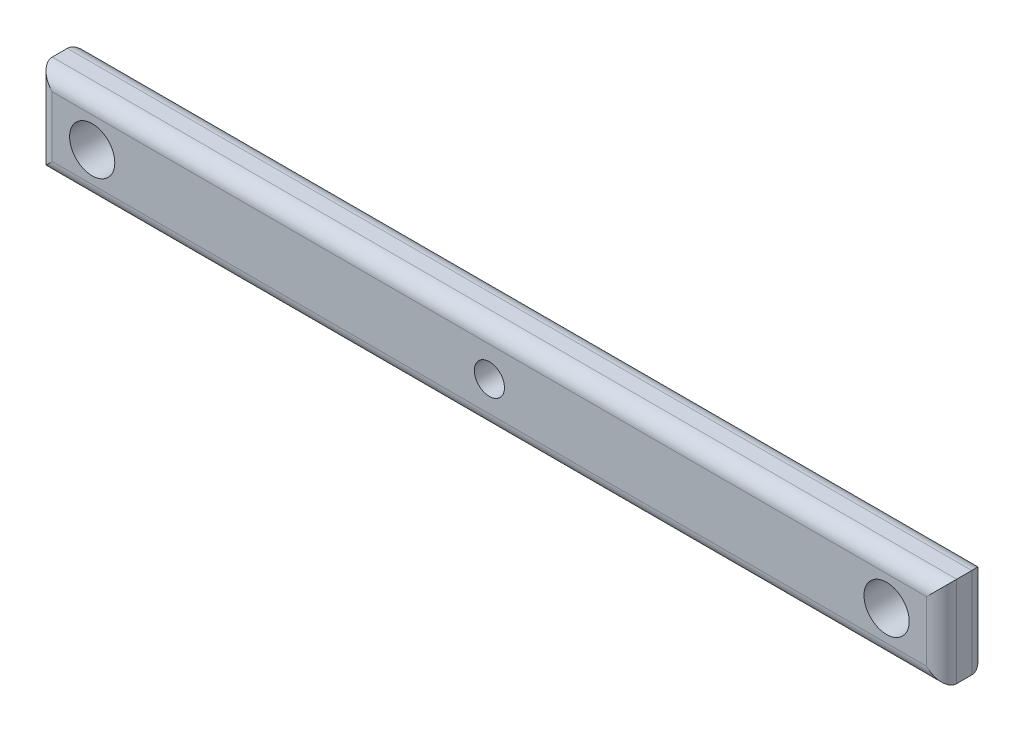
ISO-10303-21;
HEADER;
FILE_DESCRIPTION(('STEP AP214'),'2;1');
FILE_NAME('part.step','',(''),(''),'','','');
FILE_SCHEMA(('AUTOMOTIVE_DESIGN { 1 0 10303 214 1 1 1 1 }'));
ENDSEC;
DATA;
#1=APPLICATION_CONTEXT('core data for automotive mechanical design processes');
#2=APPLICATION_PROTOCOL_DEFINITION('international standard','automotive_design',2000,#1);
#3=PRODUCT_CONTEXT('',#1,'mechanical');
#4=PRODUCT('Part','Part','',(#3));
#5=PRODUCT_RELATED_PRODUCT_CATEGORY('part','',(#4));
#6=PRODUCT_DEFINITION_FORMATION('','',#4);
#7=PRODUCT_DEFINITION_CONTEXT('part definition',#1,'design');
#8=PRODUCT_DEFINITION('design','',#6,#7);
#9=PRODUCT_DEFINITION_SHAPE('','',#8);
#10=(LENGTH_UNIT() NAMED_UNIT(*) SI_UNIT(.MILLI.,.METRE.));
#11=(NAMED_UNIT(*) PLANE_ANGLE_UNIT() SI_UNIT($,.RADIAN.));
#12=(NAMED_UNIT(*) SI_UNIT($,.STERADIAN.) SOLID_ANGLE_UNIT());
#13=UNCERTAINTY_MEASURE_WITH_UNIT(LENGTH_MEASURE(1.E-05),#10,'distance_accuracy_value','');
#14=(GEOMETRIC_REPRESENTATION_CONTEXT(3) GLOBAL_UNCERTAINTY_ASSIGNED_CONTEXT((#13)) GLOBAL_UNIT_ASSIGNED_CONTEXT((#10,
#11,#12)) REPRESENTATION_CONTEXT('',''));
#15=CARTESIAN_POINT('',(0.,0.,0.));
#16=DIRECTION('',(0.,0.,1.));
#17=DIRECTION('',(1.,0.,0.));
#18=AXIS2_PLACEMENT_3D('',#15,#16,#17);
#19=CARTESIAN_POINT('',(-30.,3.,3.));
#20=DIRECTION('',(1.,0.,0.));
#21=DIRECTION('',(0.,0.,-1.));
#22=AXIS2_PLACEMENT_3D('',#19,#20,#21);
#23=PLANE('',#22);
#24=DIRECTION('',(0.,0.,-1.));
#25=VECTOR('',#24,1.);
#26=CARTESIAN_POINT('',(-30.,3.,3.));
#27=LINE('',#26,#25);
#28=CARTESIAN_POINT('',(-30.,3.,2.));
#29=VERTEX_POINT('',#28);
#30=CARTESIAN_POINT('',(-30.,3.,1.));
#31=VERTEX_POINT('',#30);
#32=EDGE_CURVE('E149',#29,#31,#27,.T.);
#33=ORIENTED_EDGE('',*,*,#32,.T.);
#34=DIRECTION('',(0.,-1.,0.));
#35=VECTOR('',#34,1.);
#36=CARTESIAN_POINT('',(-30.,3.,1.));
#37=LINE('',#36,#35);
#38=CARTESIAN_POINT('',(-30.,-3.,1.));
#39=VERTEX_POINT('',#38);
#40=EDGE_CURVE('E158',#31,#39,#37,.T.);
#41=ORIENTED_EDGE('',*,*,#40,.T.);
#42=DIRECTION('',(0.,0.,-1.));
#43=VECTOR('',#42,1.);
#44=CARTESIAN_POINT('',(-30.,-3.,3.));
#45=LINE('',#44,#43);
#46=CARTESIAN_POINT('',(-30.,-3.,2.));
#47=VERTEX_POINT('',#46);
#48=EDGE_CURVE('E126',#47,#39,#45,.T.);
#49=ORIENTED_EDGE('',*,*,#48,.F.);
#50=DIRECTION('',(0.,-1.,0.));
#51=VECTOR('',#50,1.);
#52=CARTESIAN_POINT('',(-30.,3.,2.));
#53=LINE('',#52,#51);
#54=EDGE_CURVE('E160',#47,#29,#53,.F.);
#55=ORIENTED_EDGE('',*,*,#54,.T.);
#56=EDGE_LOOP('',(#33,#41,#49,#55));
#57=FACE_BOUND('',#56,.T.);
#58=ADVANCED_FACE('F39',(#57),#23,.F.);
#59=CARTESIAN_POINT('',(-30.,-3.,3.));
#60=DIRECTION('',(0.,1.,0.));
#61=DIRECTION('',(-1.,0.,0.));
#62=AXIS2_PLACEMENT_3D('',#59,#60,#61);
#63=PLANE('',#62);
#64=ORIENTED_EDGE('',*,*,#48,.T.);
#65=DIRECTION('',(1.,0.,0.));
#66=VECTOR('',#65,1.);
#67=CARTESIAN_POINT('',(-30.,-3.,1.));
#68=LINE('',#67,#66);
#69=CARTESIAN_POINT('',(30.,-3.,1.));
#70=VERTEX_POINT('',#69);
#71=EDGE_CURVE('E125',#39,#70,#68,.T.);
#72=ORIENTED_EDGE('',*,*,#71,.T.);
#73=DIRECTION('',(0.,0.,-1.));
#74=VECTOR('',#73,1.);
#75=CARTESIAN_POINT('',(30.,-3.,3.));
#76=LINE('',#75,#74);
#77=CARTESIAN_POINT('',(30.,-3.,2.));
#78=VERTEX_POINT('',#77);
#79=EDGE_CURVE('E108',#78,#70,#76,.T.);
#80=ORIENTED_EDGE('',*,*,#79,.F.);
#81=DIRECTION('',(1.,0.,0.));
#82=VECTOR('',#81,1.);
#83=CARTESIAN_POINT('',(-30.,-3.,2.));
#84=LINE('',#83,#82);
#85=EDGE_CURVE('E122',#78,#47,#84,.F.);
#86=ORIENTED_EDGE('',*,*,#85,.T.);
#87=EDGE_LOOP('',(#64,#72,#80,#86));
#88=FACE_BOUND('',#87,.T.);
#89=ADVANCED_FACE('F121',(#88),#63,.F.);
#90=CARTESIAN_POINT('',(30.,3.,3.));
#91=DIRECTION('',(-1.,0.,0.));
#92=DIRECTION('',(0.,0.,1.));
#93=AXIS2_PLACEMENT_3D('',#90,#91,#92);
#94=PLANE('',#93);
#95=ORIENTED_EDGE('',*,*,#79,.T.);
#96=DIRECTION('',(0.,1.,0.));
#97=VECTOR('',#96,1.);
#98=CARTESIAN_POINT('',(30.,3.,1.));
#99=LINE('',#98,#97);
#100=CARTESIAN_POINT('',(30.,3.,1.));
#101=VERTEX_POINT('',#100);
#102=EDGE_CURVE('E114',#70,#101,#99,.T.);
#103=ORIENTED_EDGE('',*,*,#102,.T.);
#104=DIRECTION('',(0.,0.,-1.));
#105=VECTOR('',#104,1.);
#106=CARTESIAN_POINT('',(30.,3.,3.));
#107=LINE('',#106,#105);
#108=CARTESIAN_POINT('',(30.,3.,2.));
#109=VERTEX_POINT('',#108);
#110=EDGE_CURVE('E110',#109,#101,#107,.T.);
#111=ORIENTED_EDGE('',*,*,#110,.F.);
#112=DIRECTION('',(0.,1.,0.));
#113=VECTOR('',#112,1.);
#114=CARTESIAN_POINT('',(30.,-3.,2.));
#115=LINE('',#114,#113);
#116=EDGE_CURVE('E105',#109,#78,#115,.F.);
#117=ORIENTED_EDGE('',*,*,#116,.T.);
#118=EDGE_LOOP('',(#95,#103,#111,#117));
#119=FACE_BOUND('',#118,.T.);
#120=ADVANCED_FACE('F107',(#119),#94,.F.);
#121=CARTESIAN_POINT('',(-30.,3.,3.));
#122=DIRECTION('',(0.,-1.,0.));
#123=DIRECTION('',(1.,0.,0.));
#124=AXIS2_PLACEMENT_3D('',#121,#122,#123);
#125=PLANE('',#124);
#126=ORIENTED_EDGE('',*,*,#110,.T.);
#127=DIRECTION('',(-1.,0.,0.));
#128=VECTOR('',#127,1.);
#129=CARTESIAN_POINT('',(-30.,3.,1.));
#130=LINE('',#129,#128);
#131=EDGE_CURVE('E162',#101,#31,#130,.T.);
#132=ORIENTED_EDGE('',*,*,#131,.T.);
#133=ORIENTED_EDGE('',*,*,#32,.F.);
#134=DIRECTION('',(-1.,0.,0.));
#135=VECTOR('',#134,1.);
#136=CARTESIAN_POINT('',(30.,3.,2.));
#137=LINE('',#136,#135);
#138=EDGE_CURVE('E164',#29,#109,#137,.F.);
#139=ORIENTED_EDGE('',*,*,#138,.T.);
#140=EDGE_LOOP('',(#126,#132,#133,#139));
#141=FACE_BOUND('',#140,.T.);
#142=ADVANCED_FACE('F211',(#141),#125,.F.);
#143=CARTESIAN_POINT('',(0.,0.,3.));
#144=DIRECTION('',(0.,0.,1.));
#145=DIRECTION('',(1.,0.,0.));
#146=AXIS2_PLACEMENT_3D('',#143,#144,#145);
#147=PLANE('',#146);
#148=CARTESIAN_POINT('',(-26.35,0.,3.));
#149=DIRECTION('',(0.,0.,1.));
#150=DIRECTION('',(1.,0.,0.));
#151=AXIS2_PLACEMENT_3D('',#148,#149,#150);
#152=CIRCLE('',#151,1.5);
#153=CARTESIAN_POINT('',(-24.85,0.,3.));
#154=VERTEX_POINT('',#153);
#155=EDGE_CURVE('E192',#154,#154,#152,.T.);
#156=ORIENTED_EDGE('',*,*,#155,.F.);
#157=EDGE_LOOP('',(#156));
#158=FACE_BOUND('',#157,.T.);
#159=CARTESIAN_POINT('',(26.35,0.,3.));
#160=DIRECTION('',(0.,0.,1.));
#161=DIRECTION('',(1.,0.,0.));
#162=AXIS2_PLACEMENT_3D('',#159,#160,#161);
#163=CIRCLE('',#162,1.5);
#164=CARTESIAN_POINT('',(27.85,0.,3.));
#165=VERTEX_POINT('',#164);
#166=EDGE_CURVE('E189',#165,#165,#163,.T.);
#167=ORIENTED_EDGE('',*,*,#166,.F.);
#168=EDGE_LOOP('',(#167));
#169=FACE_BOUND('',#168,.T.);
#170=CARTESIAN_POINT('',(0.,0.,3.));
#171=DIRECTION('',(0.,0.,1.));
#172=DIRECTION('',(1.,0.,0.));
#173=AXIS2_PLACEMENT_3D('',#170,#171,#172);
#174=CIRCLE('',#173,1.);
#175=CARTESIAN_POINT('',(1.,0.,3.));
#176=VERTEX_POINT('',#175);
#177=EDGE_CURVE('E183',#176,#176,#174,.T.);
#178=ORIENTED_EDGE('',*,*,#177,.F.);
#179=EDGE_LOOP('',(#178));
#180=FACE_BOUND('',#179,.T.);
#181=DIRECTION('',(0.,1.,0.));
#182=VECTOR('',#181,1.);
#183=CARTESIAN_POINT('',(29.,3.,3.));
#184=LINE('',#183,#182);
#185=CARTESIAN_POINT('',(29.,-2.,3.));
#186=VERTEX_POINT('',#185);
#187=CARTESIAN_POINT('',(29.,2.,3.));
#188=VERTEX_POINT('',#187);
#189=EDGE_CURVE('E48',#186,#188,#184,.T.);
#190=ORIENTED_EDGE('',*,*,#189,.T.);
#191=DIRECTION('',(-1.,0.,0.));
#192=VECTOR('',#191,1.);
#193=CARTESIAN_POINT('',(-30.,2.,3.));
#194=LINE('',#193,#192);
#195=CARTESIAN_POINT('',(-29.,2.,3.));
#196=VERTEX_POINT('',#195);
#197=EDGE_CURVE('E11',#188,#196,#194,.T.);
#198=ORIENTED_EDGE('',*,*,#197,.T.);
#199=DIRECTION('',(0.,-1.,0.));
#200=VECTOR('',#199,1.);
#201=CARTESIAN_POINT('',(-29.,-3.,3.));
#202=LINE('',#201,#200);
#203=CARTESIAN_POINT('',(-29.,-2.,3.));
#204=VERTEX_POINT('',#203);
#205=EDGE_CURVE('E156',#196,#204,#202,.T.);
#206=ORIENTED_EDGE('',*,*,#205,.T.);
#207=DIRECTION('',(1.,0.,0.));
#208=VECTOR('',#207,1.);
#209=CARTESIAN_POINT('',(30.,-2.,3.));
#210=LINE('',#209,#208);
#211=EDGE_CURVE('E59',#204,#186,#210,.T.);
#212=ORIENTED_EDGE('',*,*,#211,.T.);
#213=EDGE_LOOP('',(#190,#198,#206,#212));
#214=FACE_BOUND('',#213,.T.);
#215=ADVANCED_FACE('F208',(#158,#169,#180,#214),#147,.T.);
#216=CARTESIAN_POINT('',(0.,0.,0.));
#217=DIRECTION('',(0.,0.,1.));
#218=DIRECTION('',(1.,0.,0.));
#219=AXIS2_PLACEMENT_3D('',#216,#217,#218);
#220=PLANE('',#219);
#221=CARTESIAN_POINT('',(-26.35,0.,0.));
#222=DIRECTION('',(0.,0.,1.));
#223=DIRECTION('',(1.,0.,0.));
#224=AXIS2_PLACEMENT_3D('',#221,#222,#223);
#225=CIRCLE('',#224,1.5);
#226=CARTESIAN_POINT('',(-24.85,0.,0.));
#227=VERTEX_POINT('',#226);
#228=EDGE_CURVE('E145',#227,#227,#225,.T.);
#229=ORIENTED_EDGE('',*,*,#228,.T.);
#230=EDGE_LOOP('',(#229));
#231=FACE_BOUND('',#230,.T.);
#232=CARTESIAN_POINT('',(26.35,0.,0.));
#233=DIRECTION('',(0.,0.,1.));
#234=DIRECTION('',(1.,0.,0.));
#235=AXIS2_PLACEMENT_3D('',#232,#233,#234);
#236=CIRCLE('',#235,1.5);
#237=CARTESIAN_POINT('',(27.85,0.,0.));
#238=VERTEX_POINT('',#237);
#239=EDGE_CURVE('E186',#238,#238,#236,.T.);
#240=ORIENTED_EDGE('',*,*,#239,.T.);
#241=EDGE_LOOP('',(#240));
#242=FACE_BOUND('',#241,.T.);
#243=CARTESIAN_POINT('',(0.,0.,0.));
#244=DIRECTION('',(0.,0.,1.));
#245=DIRECTION('',(1.,0.,0.));
#246=AXIS2_PLACEMENT_3D('',#243,#244,#245);
#247=CIRCLE('',#246,1.);
#248=CARTESIAN_POINT('',(1.,0.,0.));
#249=VERTEX_POINT('',#248);
#250=EDGE_CURVE('E180',#249,#249,#247,.T.);
#251=ORIENTED_EDGE('',*,*,#250,.T.);
#252=EDGE_LOOP('',(#251));
#253=FACE_BOUND('',#252,.T.);
#254=DIRECTION('',(0.,1.,0.));
#255=VECTOR('',#254,1.);
#256=CARTESIAN_POINT('',(29.,0.,0.));
#257=LINE('',#256,#255);
#258=CARTESIAN_POINT('',(29.,2.,0.));
#259=VERTEX_POINT('',#258);
#260=CARTESIAN_POINT('',(29.,-2.,0.));
#261=VERTEX_POINT('',#260);
#262=EDGE_CURVE('E169',#259,#261,#257,.F.);
#263=ORIENTED_EDGE('',*,*,#262,.T.);
#264=DIRECTION('',(1.,0.,0.));
#265=VECTOR('',#264,1.);
#266=CARTESIAN_POINT('',(0.,-2.,0.));
#267=LINE('',#266,#265);
#268=CARTESIAN_POINT('',(-29.,-2.,0.));
#269=VERTEX_POINT('',#268);
#270=EDGE_CURVE('E115',#261,#269,#267,.F.);
#271=ORIENTED_EDGE('',*,*,#270,.T.);
#272=DIRECTION('',(0.,-1.,0.));
#273=VECTOR('',#272,1.);
#274=CARTESIAN_POINT('',(-29.,0.,0.));
#275=LINE('',#274,#273);
#276=CARTESIAN_POINT('',(-29.,2.,0.));
#277=VERTEX_POINT('',#276);
#278=EDGE_CURVE('E173',#269,#277,#275,.F.);
#279=ORIENTED_EDGE('',*,*,#278,.T.);
#280=DIRECTION('',(-1.,0.,0.));
#281=VECTOR('',#280,1.);
#282=CARTESIAN_POINT('',(0.,2.,0.));
#283=LINE('',#282,#281);
#284=EDGE_CURVE('E171',#277,#259,#283,.F.);
#285=ORIENTED_EDGE('',*,*,#284,.T.);
#286=EDGE_LOOP('',(#263,#271,#279,#285));
#287=FACE_BOUND('',#286,.T.);
#288=ADVANCED_FACE('F198',(#231,#242,#253,#287),#220,.F.);
#289=CARTESIAN_POINT('',(-30.,2.,1.));
#290=DIRECTION('',(-1.,0.,0.));
#291=DIRECTION('',(0.,-1.,0.));
#292=AXIS2_PLACEMENT_3D('',#289,#290,#291);
#293=CYLINDRICAL_SURFACE('',#292,1.);
#294=CARTESIAN_POINT('',(29.,2.,1.));
#295=DIRECTION('',(-0.707106781186547,0.707106781186547,0.));
#296=DIRECTION('',(-0.707106781186548,-0.707106781186547,0.));
#297=AXIS2_PLACEMENT_3D('',#294,#295,#296);
#298=ELLIPSE('',#297,1.41421356237309,1.);
#299=EDGE_CURVE('E150',#259,#101,#298,.F.);
#300=ORIENTED_EDGE('',*,*,#299,.F.);
#301=ORIENTED_EDGE('',*,*,#284,.F.);
#302=CARTESIAN_POINT('',(-29.,2.,1.));
#303=DIRECTION('',(-0.707106781186548,-0.707106781186547,0.));
#304=DIRECTION('',(0.707106781186547,-0.707106781186547,0.));
#305=AXIS2_PLACEMENT_3D('',#302,#303,#304);
#306=ELLIPSE('',#305,1.4142135623731,1.);
#307=EDGE_CURVE('E146',#31,#277,#306,.T.);
#308=ORIENTED_EDGE('',*,*,#307,.F.);
#309=ORIENTED_EDGE('',*,*,#131,.F.);
#310=EDGE_LOOP('',(#300,#301,#308,#309));
#311=FACE_BOUND('',#310,.T.);
#312=ADVANCED_FACE('F253',(#311),#293,.T.);
#313=CARTESIAN_POINT('',(-29.,3.,1.));
#314=DIRECTION('',(0.,-1.,0.));
#315=DIRECTION('',(0.,0.,-1.));
#316=AXIS2_PLACEMENT_3D('',#313,#314,#315);
#317=CYLINDRICAL_SURFACE('',#316,1.);
#318=ORIENTED_EDGE('',*,*,#307,.T.);
#319=ORIENTED_EDGE('',*,*,#278,.F.);
#320=CARTESIAN_POINT('',(-29.,-2.,1.));
#321=DIRECTION('',(0.707106781186548,-0.707106781186547,0.));
#322=DIRECTION('',(-0.707106781186547,-0.707106781186547,0.));
#323=AXIS2_PLACEMENT_3D('',#320,#321,#322);
#324=ELLIPSE('',#323,1.4142135623731,1.);
#325=EDGE_CURVE('E136',#39,#269,#324,.T.);
#326=ORIENTED_EDGE('',*,*,#325,.F.);
#327=ORIENTED_EDGE('',*,*,#40,.F.);
#328=EDGE_LOOP('',(#318,#319,#326,#327));
#329=FACE_BOUND('',#328,.T.);
#330=ADVANCED_FACE('F249',(#329),#317,.T.);
#331=CARTESIAN_POINT('',(29.,3.,1.));
#332=DIRECTION('',(0.,1.,0.));
#333=DIRECTION('',(0.,0.,1.));
#334=AXIS2_PLACEMENT_3D('',#331,#332,#333);
#335=CYLINDRICAL_SURFACE('',#334,1.);
#336=ORIENTED_EDGE('',*,*,#299,.T.);
#337=ORIENTED_EDGE('',*,*,#102,.F.);
#338=CARTESIAN_POINT('',(29.,-2.,1.));
#339=DIRECTION('',(0.707106781186547,0.707106781186547,0.));
#340=DIRECTION('',(-0.707106781186548,0.707106781186547,0.));
#341=AXIS2_PLACEMENT_3D('',#338,#339,#340);
#342=ELLIPSE('',#341,1.41421356237309,1.);
#343=EDGE_CURVE('E135',#261,#70,#342,.F.);
#344=ORIENTED_EDGE('',*,*,#343,.F.);
#345=ORIENTED_EDGE('',*,*,#262,.F.);
#346=EDGE_LOOP('',(#336,#337,#344,#345));
#347=FACE_BOUND('',#346,.T.);
#348=ADVANCED_FACE('F245',(#347),#335,.T.);
#349=CARTESIAN_POINT('',(-30.,-2.,1.));
#350=DIRECTION('',(1.,0.,0.));
#351=DIRECTION('',(0.,1.,0.));
#352=AXIS2_PLACEMENT_3D('',#349,#350,#351);
#353=CYLINDRICAL_SURFACE('',#352,1.);
#354=ORIENTED_EDGE('',*,*,#325,.T.);
#355=ORIENTED_EDGE('',*,*,#270,.F.);
#356=ORIENTED_EDGE('',*,*,#343,.T.);
#357=ORIENTED_EDGE('',*,*,#71,.F.);
#358=EDGE_LOOP('',(#354,#355,#356,#357));
#359=FACE_BOUND('',#358,.T.);
#360=ADVANCED_FACE('F242',(#359),#353,.T.);
#361=CARTESIAN_POINT('',(0.,-2.,2.));
#362=DIRECTION('',(-1.,0.,0.));
#363=DIRECTION('',(0.,-1.,0.));
#364=AXIS2_PLACEMENT_3D('',#361,#362,#363);
#365=CYLINDRICAL_SURFACE('',#364,1.);
#366=CARTESIAN_POINT('',(-29.,-2.,2.));
#367=DIRECTION('',(-0.707106781186548,0.707106781186547,0.));
#368=DIRECTION('',(0.707106781186547,0.707106781186547,0.));
#369=AXIS2_PLACEMENT_3D('',#366,#367,#368);
#370=ELLIPSE('',#369,1.4142135623731,1.);
#371=EDGE_CURVE('E131',#47,#204,#370,.T.);
#372=ORIENTED_EDGE('',*,*,#371,.F.);
#373=ORIENTED_EDGE('',*,*,#85,.F.);
#374=CARTESIAN_POINT('',(29.,-2.,2.));
#375=DIRECTION('',(-0.707106781186547,-0.707106781186547,0.));
#376=DIRECTION('',(-0.707106781186548,0.707106781186547,0.));
#377=AXIS2_PLACEMENT_3D('',#374,#375,#376);
#378=ELLIPSE('',#377,1.41421356237309,1.);
#379=EDGE_CURVE('E43',#186,#78,#378,.F.);
#380=ORIENTED_EDGE('',*,*,#379,.F.);
#381=ORIENTED_EDGE('',*,*,#211,.F.);
#382=EDGE_LOOP('',(#372,#373,#380,#381));
#383=FACE_BOUND('',#382,.T.);
#384=ADVANCED_FACE('F41',(#383),#365,.T.);
#385=CARTESIAN_POINT('',(29.,0.,2.));
#386=DIRECTION('',(0.,-1.,0.));
#387=DIRECTION('',(0.,0.,-1.));
#388=AXIS2_PLACEMENT_3D('',#385,#386,#387);
#389=CYLINDRICAL_SURFACE('',#388,1.);
#390=ORIENTED_EDGE('',*,*,#379,.T.);
#391=ORIENTED_EDGE('',*,*,#116,.F.);
#392=CARTESIAN_POINT('',(29.,2.,2.));
#393=DIRECTION('',(0.707106781186547,-0.707106781186547,0.));
#394=DIRECTION('',(-0.707106781186548,-0.707106781186547,0.));
#395=AXIS2_PLACEMENT_3D('',#392,#393,#394);
#396=ELLIPSE('',#395,1.41421356237309,1.);
#397=EDGE_CURVE('E138',#188,#109,#396,.F.);
#398=ORIENTED_EDGE('',*,*,#397,.F.);
#399=ORIENTED_EDGE('',*,*,#189,.F.);
#400=EDGE_LOOP('',(#390,#391,#398,#399));
#401=FACE_BOUND('',#400,.T.);
#402=ADVANCED_FACE('F134',(#401),#389,.T.);
#403=CARTESIAN_POINT('',(-29.,0.,2.));
#404=DIRECTION('',(0.,1.,0.));
#405=DIRECTION('',(0.,0.,1.));
#406=AXIS2_PLACEMENT_3D('',#403,#404,#405);
#407=CYLINDRICAL_SURFACE('',#406,1.);
#408=ORIENTED_EDGE('',*,*,#371,.T.);
#409=ORIENTED_EDGE('',*,*,#205,.F.);
#410=CARTESIAN_POINT('',(-29.,2.,2.));
#411=DIRECTION('',(0.707106781186548,0.707106781186547,0.));
#412=DIRECTION('',(-0.707106781186547,0.707106781186547,0.));
#413=AXIS2_PLACEMENT_3D('',#410,#411,#412);
#414=ELLIPSE('',#413,1.4142135623731,1.);
#415=EDGE_CURVE('E141',#29,#196,#414,.T.);
#416=ORIENTED_EDGE('',*,*,#415,.F.);
#417=ORIENTED_EDGE('',*,*,#54,.F.);
#418=EDGE_LOOP('',(#408,#409,#416,#417));
#419=FACE_BOUND('',#418,.T.);
#420=ADVANCED_FACE('F229',(#419),#407,.T.);
#421=CARTESIAN_POINT('',(0.,2.,2.));
#422=DIRECTION('',(1.,0.,0.));
#423=DIRECTION('',(0.,1.,0.));
#424=AXIS2_PLACEMENT_3D('',#421,#422,#423);
#425=CYLINDRICAL_SURFACE('',#424,1.);
#426=ORIENTED_EDGE('',*,*,#397,.T.);
#427=ORIENTED_EDGE('',*,*,#138,.F.);
#428=ORIENTED_EDGE('',*,*,#415,.T.);
#429=ORIENTED_EDGE('',*,*,#197,.F.);
#430=EDGE_LOOP('',(#426,#427,#428,#429));
#431=FACE_BOUND('',#430,.T.);
#432=ADVANCED_FACE('F219',(#431),#425,.T.);
#433=CARTESIAN_POINT('',(0.,0.,0.));
#434=DIRECTION('',(0.,0.,1.));
#435=DIRECTION('',(1.,0.,0.));
#436=AXIS2_PLACEMENT_3D('',#433,#434,#435);
#437=CYLINDRICAL_SURFACE('',#436,1.);
#438=ORIENTED_EDGE('',*,*,#250,.F.);
#439=EDGE_LOOP('',(#438));
#440=FACE_BOUND('',#439,.T.);
#441=ORIENTED_EDGE('',*,*,#177,.T.);
#442=EDGE_LOOP('',(#441));
#443=FACE_BOUND('',#442,.T.);
#444=ADVANCED_FACE('F217',(#440,#443),#437,.F.);
#445=CARTESIAN_POINT('',(26.35,0.,0.));
#446=DIRECTION('',(0.,0.,1.));
#447=DIRECTION('',(1.,0.,0.));
#448=AXIS2_PLACEMENT_3D('',#445,#446,#447);
#449=CYLINDRICAL_SURFACE('',#448,1.5);
#450=ORIENTED_EDGE('',*,*,#239,.F.);
#451=EDGE_LOOP('',(#450));
#452=FACE_BOUND('',#451,.T.);
#453=ORIENTED_EDGE('',*,*,#166,.T.);
#454=EDGE_LOOP('',(#453));
#455=FACE_BOUND('',#454,.T.);
#456=ADVANCED_FACE('F204',(#452,#455),#449,.F.);
#457=CARTESIAN_POINT('',(-26.35,0.,0.));
#458=DIRECTION('',(0.,0.,1.));
#459=DIRECTION('',(1.,0.,0.));
#460=AXIS2_PLACEMENT_3D('',#457,#458,#459);
#461=CYLINDRICAL_SURFACE('',#460,1.5);
#462=ORIENTED_EDGE('',*,*,#228,.F.);
#463=EDGE_LOOP('',(#462));
#464=FACE_BOUND('',#463,.T.);
#465=ORIENTED_EDGE('',*,*,#155,.T.);
#466=EDGE_LOOP('',(#465));
#467=FACE_BOUND('',#466,.T.);
#468=ADVANCED_FACE('F201',(#464,#467),#461,.F.);
#469=CLOSED_SHELL('',(#58,#89,#120,#142,#215,#288,#312,#330,#348,#360,#384,#402,#420,#432,#444,
#456,#468));
#470=MANIFOLD_SOLID_BREP('B2',#469);
#471=ADVANCED_BREP_SHAPE_REPRESENTATION('',(#18,#470),#14);
#472=SHAPE_DEFINITION_REPRESENTATION(#9,#471);
ENDSEC;
END-ISO-10303-21;
